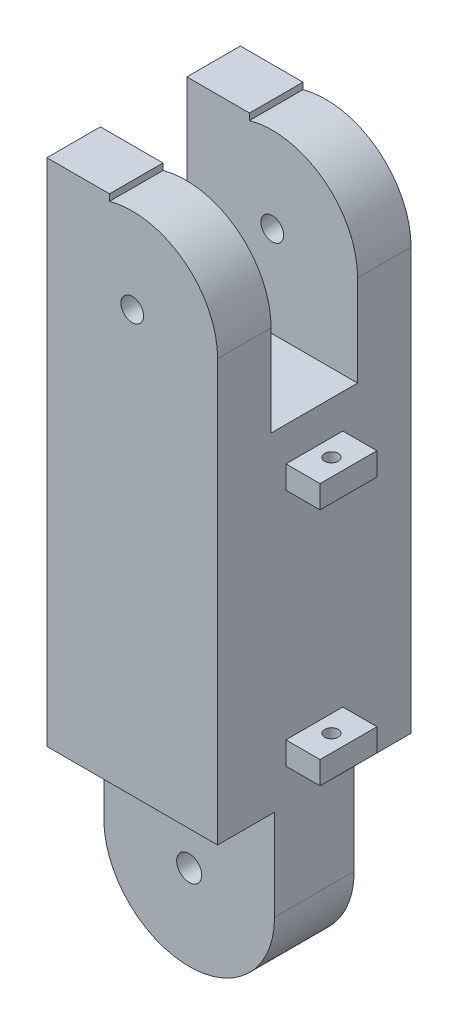
ISO-10303-21;
HEADER;
FILE_DESCRIPTION(('STEP AP214'),'2;1');
FILE_NAME('part.step','',(''),(''),'','','');
FILE_SCHEMA(('AUTOMOTIVE_DESIGN { 1 0 10303 214 1 1 1 1 }'));
ENDSEC;
DATA;
#1=APPLICATION_CONTEXT('core data for automotive mechanical design processes');
#2=APPLICATION_PROTOCOL_DEFINITION('international standard','automotive_design',2000,#1);
#3=PRODUCT_CONTEXT('',#1,'mechanical');
#4=PRODUCT('Part','Part','',(#3));
#5=PRODUCT_RELATED_PRODUCT_CATEGORY('part','',(#4));
#6=PRODUCT_DEFINITION_FORMATION('','',#4);
#7=PRODUCT_DEFINITION_CONTEXT('part definition',#1,'design');
#8=PRODUCT_DEFINITION('design','',#6,#7);
#9=PRODUCT_DEFINITION_SHAPE('','',#8);
#10=(LENGTH_UNIT() NAMED_UNIT(*) SI_UNIT(.MILLI.,.METRE.));
#11=(NAMED_UNIT(*) PLANE_ANGLE_UNIT() SI_UNIT($,.RADIAN.));
#12=(NAMED_UNIT(*) SI_UNIT($,.STERADIAN.) SOLID_ANGLE_UNIT());
#13=UNCERTAINTY_MEASURE_WITH_UNIT(LENGTH_MEASURE(1.E-05),#10,'distance_accuracy_value','');
#14=(GEOMETRIC_REPRESENTATION_CONTEXT(3) GLOBAL_UNCERTAINTY_ASSIGNED_CONTEXT((#13)) GLOBAL_UNIT_ASSIGNED_CONTEXT((#10,
#11,#12)) REPRESENTATION_CONTEXT('',''));
#15=CARTESIAN_POINT('',(0.,0.,0.));
#16=DIRECTION('',(0.,0.,1.));
#17=DIRECTION('',(1.,0.,0.));
#18=AXIS2_PLACEMENT_3D('',#15,#16,#17);
#19=CARTESIAN_POINT('',(7.5,0.,8.5));
#20=DIRECTION('',(-1.,0.,0.));
#21=DIRECTION('',(0.,0.,1.));
#22=AXIS2_PLACEMENT_3D('',#19,#20,#21);
#23=PLANE('',#22);
#24=DIRECTION('',(0.,1.,0.));
#25=VECTOR('',#24,1.);
#26=CARTESIAN_POINT('',(7.5,37.,-3.8));
#27=LINE('',#26,#25);
#28=CARTESIAN_POINT('',(7.5,37.,-3.8));
#29=VERTEX_POINT('',#28);
#30=CARTESIAN_POINT('',(7.5,45.,-3.8));
#31=VERTEX_POINT('',#30);
#32=EDGE_CURVE('E266',#29,#31,#27,.T.);
#33=ORIENTED_EDGE('',*,*,#32,.F.);
#34=DIRECTION('',(0.,0.,-1.));
#35=VECTOR('',#34,1.);
#36=CARTESIAN_POINT('',(7.5,37.,-3.8));
#37=LINE('',#36,#35);
#38=CARTESIAN_POINT('',(7.5,37.,3.8));
#39=VERTEX_POINT('',#38);
#40=EDGE_CURVE('E269',#39,#29,#37,.T.);
#41=ORIENTED_EDGE('',*,*,#40,.F.);
#42=DIRECTION('',(0.,-1.,0.));
#43=VECTOR('',#42,1.);
#44=CARTESIAN_POINT('',(7.5,37.,3.8));
#45=LINE('',#44,#43);
#46=CARTESIAN_POINT('',(7.5,45.,3.8));
#47=VERTEX_POINT('',#46);
#48=EDGE_CURVE('E268',#47,#39,#45,.T.);
#49=ORIENTED_EDGE('',*,*,#48,.F.);
#50=DIRECTION('',(0.,0.,-1.));
#51=VECTOR('',#50,1.);
#52=CARTESIAN_POINT('',(7.5,45.,8.5));
#53=LINE('',#52,#51);
#54=CARTESIAN_POINT('',(7.5,45.,8.5));
#55=VERTEX_POINT('',#54);
#56=EDGE_CURVE('E369',#55,#47,#53,.T.);
#57=ORIENTED_EDGE('',*,*,#56,.F.);
#58=DIRECTION('',(0.,1.,0.));
#59=VECTOR('',#58,1.);
#60=CARTESIAN_POINT('',(7.5,0.,8.5));
#61=LINE('',#60,#59);
#62=CARTESIAN_POINT('',(7.5,7.99813007926781,8.5));
#63=VERTEX_POINT('',#62);
#64=EDGE_CURVE('E349',#63,#55,#61,.T.);
#65=ORIENTED_EDGE('',*,*,#64,.F.);
#66=DIRECTION('',(0.,0.,1.));
#67=VECTOR('',#66,1.);
#68=CARTESIAN_POINT('',(7.5,7.99813007926781,3.5));
#69=LINE('',#68,#67);
#70=CARTESIAN_POINT('',(7.5,7.99813007926781,3.5));
#71=VERTEX_POINT('',#70);
#72=EDGE_CURVE('E339',#71,#63,#69,.T.);
#73=ORIENTED_EDGE('',*,*,#72,.F.);
#74=DIRECTION('',(0.,1.,0.));
#75=VECTOR('',#74,1.);
#76=CARTESIAN_POINT('',(7.5,-8.,3.5));
#77=LINE('',#76,#75);
#78=CARTESIAN_POINT('',(7.5,0.,3.5));
#79=VERTEX_POINT('',#78);
#80=EDGE_CURVE('E385',#79,#71,#77,.T.);
#81=ORIENTED_EDGE('',*,*,#80,.F.);
#82=DIRECTION('',(0.,0.,-1.));
#83=VECTOR('',#82,1.);
#84=CARTESIAN_POINT('',(7.5,0.,8.5));
#85=LINE('',#84,#83);
#86=CARTESIAN_POINT('',(7.5,0.,-3.5));
#87=VERTEX_POINT('',#86);
#88=EDGE_CURVE('E375',#79,#87,#85,.T.);
#89=ORIENTED_EDGE('',*,*,#88,.T.);
#90=DIRECTION('',(0.,-1.,0.));
#91=VECTOR('',#90,1.);
#92=CARTESIAN_POINT('',(7.5,-8.,-3.5));
#93=LINE('',#92,#91);
#94=CARTESIAN_POINT('',(7.5,7.99813007926781,-3.5));
#95=VERTEX_POINT('',#94);
#96=EDGE_CURVE('E383',#95,#87,#93,.T.);
#97=ORIENTED_EDGE('',*,*,#96,.F.);
#98=DIRECTION('',(0.,0.,1.));
#99=VECTOR('',#98,1.);
#100=CARTESIAN_POINT('',(7.5,7.99813007926781,-3.5));
#101=LINE('',#100,#99);
#102=CARTESIAN_POINT('',(7.5,7.99813007926781,-8.5));
#103=VERTEX_POINT('',#102);
#104=EDGE_CURVE('E330',#103,#95,#101,.T.);
#105=ORIENTED_EDGE('',*,*,#104,.F.);
#106=DIRECTION('',(0.,1.,0.));
#107=VECTOR('',#106,1.);
#108=CARTESIAN_POINT('',(7.5,0.,-8.5));
#109=LINE('',#108,#107);
#110=CARTESIAN_POINT('',(7.5,45.,-8.5));
#111=VERTEX_POINT('',#110);
#112=EDGE_CURVE('E346',#103,#111,#109,.T.);
#113=ORIENTED_EDGE('',*,*,#112,.T.);
#114=EDGE_CURVE('E366',#31,#111,#53,.T.);
#115=ORIENTED_EDGE('',*,*,#114,.F.);
#116=EDGE_LOOP('',(#33,#41,#49,#57,#65,#73,#81,#89,#97,#105,#113,#115));
#117=FACE_BOUND('',#116,.T.);
#118=DIRECTION('',(0.,0.,-1.));
#119=VECTOR('',#118,1.);
#120=CARTESIAN_POINT('',(7.5,11.,8.5));
#121=LINE('',#120,#119);
#122=CARTESIAN_POINT('',(7.5,11.,2.5));
#123=VERTEX_POINT('',#122);
#124=CARTESIAN_POINT('',(7.5,11.,-2.5));
#125=VERTEX_POINT('',#124);
#126=EDGE_CURVE('E65',#123,#125,#121,.T.);
#127=ORIENTED_EDGE('',*,*,#126,.F.);
#128=DIRECTION('',(0.,1.,0.));
#129=VECTOR('',#128,1.);
#130=CARTESIAN_POINT('',(7.5,0.,2.5));
#131=LINE('',#130,#129);
#132=CARTESIAN_POINT('',(7.5,13.,2.5));
#133=VERTEX_POINT('',#132);
#134=EDGE_CURVE('E401',#123,#133,#131,.T.);
#135=ORIENTED_EDGE('',*,*,#134,.T.);
#136=DIRECTION('',(0.,0.,1.));
#137=VECTOR('',#136,1.);
#138=CARTESIAN_POINT('',(7.5,13.,8.5));
#139=LINE('',#138,#137);
#140=CARTESIAN_POINT('',(7.5,13.,-2.5));
#141=VERTEX_POINT('',#140);
#142=EDGE_CURVE('E399',#141,#133,#139,.T.);
#143=ORIENTED_EDGE('',*,*,#142,.F.);
#144=DIRECTION('',(0.,1.,0.));
#145=VECTOR('',#144,1.);
#146=CARTESIAN_POINT('',(7.5,0.,-2.5));
#147=LINE('',#146,#145);
#148=EDGE_CURVE('E394',#125,#141,#147,.T.);
#149=ORIENTED_EDGE('',*,*,#148,.F.);
#150=EDGE_LOOP('',(#127,#135,#143,#149));
#151=FACE_BOUND('',#150,.T.);
#152=DIRECTION('',(0.,-1.,0.));
#153=VECTOR('',#152,1.);
#154=CARTESIAN_POINT('',(7.5,0.,2.5));
#155=LINE('',#154,#153);
#156=CARTESIAN_POINT('',(7.5,34.,2.5));
#157=VERTEX_POINT('',#156);
#158=CARTESIAN_POINT('',(7.5,32.,2.5));
#159=VERTEX_POINT('',#158);
#160=EDGE_CURVE('E11',#157,#159,#155,.T.);
#161=ORIENTED_EDGE('',*,*,#160,.F.);
#162=DIRECTION('',(0.,0.,1.));
#163=VECTOR('',#162,1.);
#164=CARTESIAN_POINT('',(7.5,34.,8.5));
#165=LINE('',#164,#163);
#166=CARTESIAN_POINT('',(7.5,34.,-2.5));
#167=VERTEX_POINT('',#166);
#168=EDGE_CURVE('E410',#167,#157,#165,.T.);
#169=ORIENTED_EDGE('',*,*,#168,.F.);
#170=DIRECTION('',(0.,-1.,0.));
#171=VECTOR('',#170,1.);
#172=CARTESIAN_POINT('',(7.5,0.,-2.5));
#173=LINE('',#172,#171);
#174=CARTESIAN_POINT('',(7.5,32.,-2.5));
#175=VERTEX_POINT('',#174);
#176=EDGE_CURVE('E403',#167,#175,#173,.T.);
#177=ORIENTED_EDGE('',*,*,#176,.T.);
#178=DIRECTION('',(0.,0.,-1.));
#179=VECTOR('',#178,1.);
#180=CARTESIAN_POINT('',(7.5,32.,8.5));
#181=LINE('',#180,#179);
#182=EDGE_CURVE('E48',#159,#175,#181,.T.);
#183=ORIENTED_EDGE('',*,*,#182,.F.);
#184=EDGE_LOOP('',(#161,#169,#177,#183));
#185=FACE_BOUND('',#184,.T.);
#186=ADVANCED_FACE('F39',(#117,#151,#185),#23,.F.);
#187=CARTESIAN_POINT('',(0.,45.,8.5));
#188=DIRECTION('',(0.,0.,-1.));
#189=DIRECTION('',(-1.,0.,0.));
#190=AXIS2_PLACEMENT_3D('',#187,#188,#189);
#191=CYLINDRICAL_SURFACE('',#190,7.5);
#192=DIRECTION('',(0.,0.,-1.));
#193=VECTOR('',#192,1.);
#194=CARTESIAN_POINT('',(-2.,52.2284161474005,8.5));
#195=LINE('',#194,#193);
#196=CARTESIAN_POINT('',(-2.,52.2284161474005,-3.8));
#197=VERTEX_POINT('',#196);
#198=CARTESIAN_POINT('',(-2.,52.2284161474005,-8.5));
#199=VERTEX_POINT('',#198);
#200=EDGE_CURVE('E318',#197,#199,#195,.T.);
#201=ORIENTED_EDGE('',*,*,#200,.F.);
#202=CARTESIAN_POINT('',(0.,45.,-3.8));
#203=DIRECTION('',(0.,0.,-1.));
#204=DIRECTION('',(-1.,0.,0.));
#205=AXIS2_PLACEMENT_3D('',#202,#203,#204);
#206=CIRCLE('',#205,7.5);
#207=EDGE_CURVE('E297',#197,#31,#206,.T.);
#208=ORIENTED_EDGE('',*,*,#207,.T.);
#209=ORIENTED_EDGE('',*,*,#114,.T.);
#210=CARTESIAN_POINT('',(0.,45.,-8.5));
#211=DIRECTION('',(0.,0.,1.));
#212=DIRECTION('',(1.,0.,0.));
#213=AXIS2_PLACEMENT_3D('',#210,#211,#212);
#214=CIRCLE('',#213,7.5);
#215=EDGE_CURVE('E363',#111,#199,#214,.T.);
#216=ORIENTED_EDGE('',*,*,#215,.T.);
#217=EDGE_LOOP('',(#201,#208,#209,#216));
#218=FACE_BOUND('',#217,.T.);
#219=ADVANCED_FACE('F435',(#218),#191,.T.);
#220=CARTESIAN_POINT('',(-2.,45.,8.5));
#221=DIRECTION('',(-1.,0.,0.));
#222=DIRECTION('',(0.,0.,1.));
#223=AXIS2_PLACEMENT_3D('',#220,#221,#222);
#224=PLANE('',#223);
#225=DIRECTION('',(0.,0.,-1.));
#226=VECTOR('',#225,1.);
#227=CARTESIAN_POINT('',(-2.,52.8,8.5));
#228=LINE('',#227,#226);
#229=CARTESIAN_POINT('',(-2.,52.8,-3.8));
#230=VERTEX_POINT('',#229);
#231=CARTESIAN_POINT('',(-2.,52.8,-8.5));
#232=VERTEX_POINT('',#231);
#233=EDGE_CURVE('E314',#230,#232,#228,.T.);
#234=ORIENTED_EDGE('',*,*,#233,.F.);
#235=DIRECTION('',(0.,-1.,0.));
#236=VECTOR('',#235,1.);
#237=CARTESIAN_POINT('',(-2.,45.,-3.8));
#238=LINE('',#237,#236);
#239=EDGE_CURVE('E291',#230,#197,#238,.T.);
#240=ORIENTED_EDGE('',*,*,#239,.T.);
#241=ORIENTED_EDGE('',*,*,#200,.T.);
#242=DIRECTION('',(0.,1.,0.));
#243=VECTOR('',#242,1.);
#244=CARTESIAN_POINT('',(-2.,45.,-8.5));
#245=LINE('',#244,#243);
#246=EDGE_CURVE('E296',#199,#232,#245,.T.);
#247=ORIENTED_EDGE('',*,*,#246,.T.);
#248=EDGE_LOOP('',(#234,#240,#241,#247));
#249=FACE_BOUND('',#248,.T.);
#250=ADVANCED_FACE('F437',(#249),#224,.F.);
#251=CARTESIAN_POINT('',(-7.5,52.8,8.5));
#252=DIRECTION('',(0.,-1.,0.));
#253=DIRECTION('',(0.,0.,-1.));
#254=AXIS2_PLACEMENT_3D('',#251,#252,#253);
#255=PLANE('',#254);
#256=DIRECTION('',(0.,0.,-1.));
#257=VECTOR('',#256,1.);
#258=CARTESIAN_POINT('',(-7.5,52.8,8.5));
#259=LINE('',#258,#257);
#260=CARTESIAN_POINT('',(-7.5,52.8,-3.8));
#261=VERTEX_POINT('',#260);
#262=CARTESIAN_POINT('',(-7.5,52.8,-8.5));
#263=VERTEX_POINT('',#262);
#264=EDGE_CURVE('E308',#261,#263,#259,.T.);
#265=ORIENTED_EDGE('',*,*,#264,.F.);
#266=DIRECTION('',(1.,0.,0.));
#267=VECTOR('',#266,1.);
#268=CARTESIAN_POINT('',(-7.5,52.8,-3.8));
#269=LINE('',#268,#267);
#270=EDGE_CURVE('E386',#261,#230,#269,.T.);
#271=ORIENTED_EDGE('',*,*,#270,.T.);
#272=ORIENTED_EDGE('',*,*,#233,.T.);
#273=DIRECTION('',(-1.,0.,0.));
#274=VECTOR('',#273,1.);
#275=CARTESIAN_POINT('',(-7.5,52.8,-8.5));
#276=LINE('',#275,#274);
#277=EDGE_CURVE('E303',#232,#263,#276,.T.);
#278=ORIENTED_EDGE('',*,*,#277,.T.);
#279=EDGE_LOOP('',(#265,#271,#272,#278));
#280=FACE_BOUND('',#279,.T.);
#281=ADVANCED_FACE('F443',(#280),#255,.F.);
#282=ORIENTED_EDGE('',*,*,#56,.T.);
#283=CARTESIAN_POINT('',(0.,45.,3.8));
#284=DIRECTION('',(0.,0.,1.));
#285=DIRECTION('',(0.,-1.,0.));
#286=AXIS2_PLACEMENT_3D('',#283,#284,#285);
#287=CIRCLE('',#286,7.5);
#288=CARTESIAN_POINT('',(-2.,52.2284161474005,3.8));
#289=VERTEX_POINT('',#288);
#290=EDGE_CURVE('E286',#47,#289,#287,.T.);
#291=ORIENTED_EDGE('',*,*,#290,.T.);
#292=CARTESIAN_POINT('',(-2.,52.2284161474005,8.5));
#293=VERTEX_POINT('',#292);
#294=EDGE_CURVE('E317',#293,#289,#195,.T.);
#295=ORIENTED_EDGE('',*,*,#294,.F.);
#296=CARTESIAN_POINT('',(0.,45.,8.5));
#297=DIRECTION('',(0.,0.,1.));
#298=DIRECTION('',(1.,0.,0.));
#299=AXIS2_PLACEMENT_3D('',#296,#297,#298);
#300=CIRCLE('',#299,7.5);
#301=EDGE_CURVE('E352',#55,#293,#300,.T.);
#302=ORIENTED_EDGE('',*,*,#301,.F.);
#303=EDGE_LOOP('',(#282,#291,#295,#302));
#304=FACE_BOUND('',#303,.T.);
#305=ADVANCED_FACE('F442',(#304),#191,.T.);
#306=CARTESIAN_POINT('',(0.,0.,8.5));
#307=DIRECTION('',(0.,0.,-1.));
#308=DIRECTION('',(-1.,0.,0.));
#309=AXIS2_PLACEMENT_3D('',#306,#307,#308);
#310=CYLINDRICAL_SURFACE('',#309,7.5);
#311=DIRECTION('',(0.,0.,-1.));
#312=VECTOR('',#311,1.);
#313=CARTESIAN_POINT('',(-7.5,0.,8.5));
#314=LINE('',#313,#312);
#315=CARTESIAN_POINT('',(-7.5,0.,3.5));
#316=VERTEX_POINT('',#315);
#317=CARTESIAN_POINT('',(-7.5,0.,-3.5));
#318=VERTEX_POINT('',#317);
#319=EDGE_CURVE('E358',#316,#318,#314,.T.);
#320=ORIENTED_EDGE('',*,*,#319,.T.);
#321=CARTESIAN_POINT('',(0.,0.,-3.5));
#322=DIRECTION('',(0.,0.,1.));
#323=DIRECTION('',(1.,0.,0.));
#324=AXIS2_PLACEMENT_3D('',#321,#322,#323);
#325=CIRCLE('',#324,7.5);
#326=EDGE_CURVE('E341',#318,#87,#325,.T.);
#327=ORIENTED_EDGE('',*,*,#326,.T.);
#328=ORIENTED_EDGE('',*,*,#88,.F.);
#329=CARTESIAN_POINT('',(0.,0.,3.5));
#330=DIRECTION('',(0.,0.,-1.));
#331=DIRECTION('',(-1.,0.,0.));
#332=AXIS2_PLACEMENT_3D('',#329,#330,#331);
#333=CIRCLE('',#332,7.5);
#334=EDGE_CURVE('E338',#79,#316,#333,.T.);
#335=ORIENTED_EDGE('',*,*,#334,.T.);
#336=EDGE_LOOP('',(#320,#327,#328,#335));
#337=FACE_BOUND('',#336,.T.);
#338=ADVANCED_FACE('F41',(#337),#310,.T.);
#339=CARTESIAN_POINT('',(-7.5,0.,8.5));
#340=DIRECTION('',(1.,0.,0.));
#341=DIRECTION('',(0.,0.,-1.));
#342=AXIS2_PLACEMENT_3D('',#339,#340,#341);
#343=PLANE('',#342);
#344=DIRECTION('',(0.,0.,-1.));
#345=VECTOR('',#344,1.);
#346=CARTESIAN_POINT('',(-7.5,37.,-3.8));
#347=LINE('',#346,#345);
#348=CARTESIAN_POINT('',(-7.5,37.,3.8));
#349=VERTEX_POINT('',#348);
#350=CARTESIAN_POINT('',(-7.5,37.,-3.8));
#351=VERTEX_POINT('',#350);
#352=EDGE_CURVE('E276',#349,#351,#347,.T.);
#353=ORIENTED_EDGE('',*,*,#352,.T.);
#354=DIRECTION('',(0.,1.,0.));
#355=VECTOR('',#354,1.);
#356=CARTESIAN_POINT('',(-7.5,37.,-3.8));
#357=LINE('',#356,#355);
#358=EDGE_CURVE('E272',#351,#261,#357,.T.);
#359=ORIENTED_EDGE('',*,*,#358,.T.);
#360=ORIENTED_EDGE('',*,*,#264,.T.);
#361=DIRECTION('',(0.,-1.,0.));
#362=VECTOR('',#361,1.);
#363=CARTESIAN_POINT('',(-7.5,0.,-8.5));
#364=LINE('',#363,#362);
#365=CARTESIAN_POINT('',(-7.5,7.99813007926781,-8.5));
#366=VERTEX_POINT('',#365);
#367=EDGE_CURVE('E354',#263,#366,#364,.T.);
#368=ORIENTED_EDGE('',*,*,#367,.T.);
#369=DIRECTION('',(0.,0.,1.));
#370=VECTOR('',#369,1.);
#371=CARTESIAN_POINT('',(-7.5,7.99813007926781,-3.5));
#372=LINE('',#371,#370);
#373=CARTESIAN_POINT('',(-7.5,7.99813007926781,-3.5));
#374=VERTEX_POINT('',#373);
#375=EDGE_CURVE('E326',#366,#374,#372,.T.);
#376=ORIENTED_EDGE('',*,*,#375,.T.);
#377=DIRECTION('',(0.,-1.,0.));
#378=VECTOR('',#377,1.);
#379=CARTESIAN_POINT('',(-7.5,-8.,-3.5));
#380=LINE('',#379,#378);
#381=EDGE_CURVE('E323',#374,#318,#380,.T.);
#382=ORIENTED_EDGE('',*,*,#381,.T.);
#383=ORIENTED_EDGE('',*,*,#319,.F.);
#384=DIRECTION('',(0.,1.,0.));
#385=VECTOR('',#384,1.);
#386=CARTESIAN_POINT('',(-7.5,-8.,3.5));
#387=LINE('',#386,#385);
#388=CARTESIAN_POINT('',(-7.5,7.99813007926781,3.5));
#389=VERTEX_POINT('',#388);
#390=EDGE_CURVE('E331',#316,#389,#387,.T.);
#391=ORIENTED_EDGE('',*,*,#390,.T.);
#392=DIRECTION('',(0.,0.,1.));
#393=VECTOR('',#392,1.);
#394=CARTESIAN_POINT('',(-7.5,7.99813007926781,3.5));
#395=LINE('',#394,#393);
#396=CARTESIAN_POINT('',(-7.5,7.99813007926781,8.5));
#397=VERTEX_POINT('',#396);
#398=EDGE_CURVE('E332',#389,#397,#395,.T.);
#399=ORIENTED_EDGE('',*,*,#398,.T.);
#400=DIRECTION('',(0.,-1.,0.));
#401=VECTOR('',#400,1.);
#402=CARTESIAN_POINT('',(-7.5,0.,8.5));
#403=LINE('',#402,#401);
#404=CARTESIAN_POINT('',(-7.5,52.8,8.5));
#405=VERTEX_POINT('',#404);
#406=EDGE_CURVE('E353',#405,#397,#403,.T.);
#407=ORIENTED_EDGE('',*,*,#406,.F.);
#408=CARTESIAN_POINT('',(-7.5,52.8,3.8));
#409=VERTEX_POINT('',#408);
#410=EDGE_CURVE('E313',#405,#409,#259,.T.);
#411=ORIENTED_EDGE('',*,*,#410,.T.);
#412=DIRECTION('',(0.,-1.,0.));
#413=VECTOR('',#412,1.);
#414=CARTESIAN_POINT('',(-7.5,37.,3.8));
#415=LINE('',#414,#413);
#416=EDGE_CURVE('E277',#409,#349,#415,.T.);
#417=ORIENTED_EDGE('',*,*,#416,.T.);
#418=EDGE_LOOP('',(#353,#359,#360,#368,#376,#382,#383,#391,#399,#407,#411,#417));
#419=FACE_BOUND('',#418,.T.);
#420=ADVANCED_FACE('F449',(#419),#343,.F.);
#421=CARTESIAN_POINT('',(0.,0.,8.5));
#422=DIRECTION('',(0.,0.,1.));
#423=DIRECTION('',(1.,0.,0.));
#424=AXIS2_PLACEMENT_3D('',#421,#422,#423);
#425=PLANE('',#424);
#426=CARTESIAN_POINT('',(0.,45.,8.5));
#427=DIRECTION('',(0.,0.,1.));
#428=DIRECTION('',(1.,0.,0.));
#429=AXIS2_PLACEMENT_3D('',#426,#427,#428);
#430=CIRCLE('',#429,1.);
#431=CARTESIAN_POINT('',(1.,45.,8.5));
#432=VERTEX_POINT('',#431);
#433=EDGE_CURVE('E254',#432,#432,#430,.T.);
#434=ORIENTED_EDGE('',*,*,#433,.F.);
#435=EDGE_LOOP('',(#434));
#436=FACE_BOUND('',#435,.T.);
#437=ORIENTED_EDGE('',*,*,#301,.T.);
#438=DIRECTION('',(0.,1.,0.));
#439=VECTOR('',#438,1.);
#440=CARTESIAN_POINT('',(-2.,45.,8.5));
#441=LINE('',#440,#439);
#442=CARTESIAN_POINT('',(-2.,52.8,8.5));
#443=VERTEX_POINT('',#442);
#444=EDGE_CURVE('E298',#293,#443,#441,.T.);
#445=ORIENTED_EDGE('',*,*,#444,.T.);
#446=DIRECTION('',(-1.,0.,0.));
#447=VECTOR('',#446,1.);
#448=CARTESIAN_POINT('',(-7.5,52.8,8.5));
#449=LINE('',#448,#447);
#450=EDGE_CURVE('E305',#443,#405,#449,.T.);
#451=ORIENTED_EDGE('',*,*,#450,.T.);
#452=ORIENTED_EDGE('',*,*,#406,.T.);
#453=DIRECTION('',(-1.,0.,0.));
#454=VECTOR('',#453,1.);
#455=CARTESIAN_POINT('',(0.,7.99813007926781,8.5));
#456=LINE('',#455,#454);
#457=EDGE_CURVE('E376',#63,#397,#456,.T.);
#458=ORIENTED_EDGE('',*,*,#457,.F.);
#459=ORIENTED_EDGE('',*,*,#64,.T.);
#460=EDGE_LOOP('',(#437,#445,#451,#452,#458,#459));
#461=FACE_BOUND('',#460,.T.);
#462=ADVANCED_FACE('F448',(#436,#461),#425,.T.);
#463=CARTESIAN_POINT('',(0.,0.,-8.5));
#464=DIRECTION('',(0.,0.,1.));
#465=DIRECTION('',(1.,0.,0.));
#466=AXIS2_PLACEMENT_3D('',#463,#464,#465);
#467=PLANE('',#466);
#468=CARTESIAN_POINT('',(0.,45.,-8.5));
#469=DIRECTION('',(0.,0.,1.));
#470=DIRECTION('',(1.,0.,0.));
#471=AXIS2_PLACEMENT_3D('',#468,#469,#470);
#472=CIRCLE('',#471,1.);
#473=CARTESIAN_POINT('',(1.,45.,-8.5));
#474=VERTEX_POINT('',#473);
#475=EDGE_CURVE('E252',#474,#474,#472,.T.);
#476=ORIENTED_EDGE('',*,*,#475,.T.);
#477=EDGE_LOOP('',(#476));
#478=FACE_BOUND('',#477,.T.);
#479=ORIENTED_EDGE('',*,*,#367,.F.);
#480=ORIENTED_EDGE('',*,*,#277,.F.);
#481=ORIENTED_EDGE('',*,*,#246,.F.);
#482=ORIENTED_EDGE('',*,*,#215,.F.);
#483=ORIENTED_EDGE('',*,*,#112,.F.);
#484=DIRECTION('',(-1.,0.,0.));
#485=VECTOR('',#484,1.);
#486=CARTESIAN_POINT('',(0.,7.99813007926781,-8.5));
#487=LINE('',#486,#485);
#488=EDGE_CURVE('E373',#103,#366,#487,.T.);
#489=ORIENTED_EDGE('',*,*,#488,.T.);
#490=EDGE_LOOP('',(#479,#480,#481,#482,#483,#489));
#491=FACE_BOUND('',#490,.T.);
#492=ADVANCED_FACE('F455',(#478,#491),#467,.F.);
#493=CARTESIAN_POINT('',(-7.5,-8.,-3.5));
#494=DIRECTION('',(0.,0.,1.));
#495=DIRECTION('',(1.,0.,0.));
#496=AXIS2_PLACEMENT_3D('',#493,#494,#495);
#497=PLANE('',#496);
#498=CARTESIAN_POINT('',(0.,0.,-3.5));
#499=DIRECTION('',(0.,0.,1.));
#500=DIRECTION('',(1.,0.,0.));
#501=AXIS2_PLACEMENT_3D('',#498,#499,#500);
#502=CIRCLE('',#501,1.1);
#503=CARTESIAN_POINT('',(1.1,0.,-3.5));
#504=VERTEX_POINT('',#503);
#505=EDGE_CURVE('E263',#504,#504,#502,.T.);
#506=ORIENTED_EDGE('',*,*,#505,.T.);
#507=EDGE_LOOP('',(#506));
#508=FACE_BOUND('',#507,.T.);
#509=ORIENTED_EDGE('',*,*,#381,.F.);
#510=DIRECTION('',(1.,0.,0.));
#511=VECTOR('',#510,1.);
#512=CARTESIAN_POINT('',(-7.5,7.99813007926781,-3.5));
#513=LINE('',#512,#511);
#514=EDGE_CURVE('E329',#374,#95,#513,.T.);
#515=ORIENTED_EDGE('',*,*,#514,.T.);
#516=ORIENTED_EDGE('',*,*,#96,.T.);
#517=ORIENTED_EDGE('',*,*,#326,.F.);
#518=EDGE_LOOP('',(#509,#515,#516,#517));
#519=FACE_BOUND('',#518,.T.);
#520=ADVANCED_FACE('F451',(#508,#519),#497,.F.);
#521=CARTESIAN_POINT('',(-7.5,7.99813007926781,-3.5));
#522=DIRECTION('',(0.,1.,0.));
#523=DIRECTION('',(0.,0.,1.));
#524=AXIS2_PLACEMENT_3D('',#521,#522,#523);
#525=PLANE('',#524);
#526=ORIENTED_EDGE('',*,*,#104,.T.);
#527=ORIENTED_EDGE('',*,*,#514,.F.);
#528=ORIENTED_EDGE('',*,*,#375,.F.);
#529=ORIENTED_EDGE('',*,*,#488,.F.);
#530=EDGE_LOOP('',(#526,#527,#528,#529));
#531=FACE_BOUND('',#530,.T.);
#532=ADVANCED_FACE('F468',(#531),#525,.F.);
#533=CARTESIAN_POINT('',(-7.5,-8.,3.5));
#534=DIRECTION('',(0.,0.,-1.));
#535=DIRECTION('',(-1.,0.,0.));
#536=AXIS2_PLACEMENT_3D('',#533,#534,#535);
#537=PLANE('',#536);
#538=CARTESIAN_POINT('',(0.,0.,3.5));
#539=DIRECTION('',(0.,0.,-1.));
#540=DIRECTION('',(-1.,0.,0.));
#541=AXIS2_PLACEMENT_3D('',#538,#539,#540);
#542=CIRCLE('',#541,1.1);
#543=CARTESIAN_POINT('',(1.1,0.,3.5));
#544=VERTEX_POINT('',#543);
#545=EDGE_CURVE('E265',#544,#544,#542,.T.);
#546=ORIENTED_EDGE('',*,*,#545,.T.);
#547=EDGE_LOOP('',(#546));
#548=FACE_BOUND('',#547,.T.);
#549=ORIENTED_EDGE('',*,*,#80,.T.);
#550=DIRECTION('',(1.,0.,0.));
#551=VECTOR('',#550,1.);
#552=CARTESIAN_POINT('',(-7.5,7.99813007926781,3.5));
#553=LINE('',#552,#551);
#554=EDGE_CURVE('E325',#389,#71,#553,.T.);
#555=ORIENTED_EDGE('',*,*,#554,.F.);
#556=ORIENTED_EDGE('',*,*,#390,.F.);
#557=ORIENTED_EDGE('',*,*,#334,.F.);
#558=EDGE_LOOP('',(#549,#555,#556,#557));
#559=FACE_BOUND('',#558,.T.);
#560=ADVANCED_FACE('F461',(#548,#559),#537,.F.);
#561=CARTESIAN_POINT('',(-7.5,7.99813007926781,3.5));
#562=DIRECTION('',(0.,1.,0.));
#563=DIRECTION('',(0.,0.,1.));
#564=AXIS2_PLACEMENT_3D('',#561,#562,#563);
#565=PLANE('',#564);
#566=ORIENTED_EDGE('',*,*,#457,.T.);
#567=ORIENTED_EDGE('',*,*,#398,.F.);
#568=ORIENTED_EDGE('',*,*,#554,.T.);
#569=ORIENTED_EDGE('',*,*,#72,.T.);
#570=EDGE_LOOP('',(#566,#567,#568,#569));
#571=FACE_BOUND('',#570,.T.);
#572=ADVANCED_FACE('F458',(#571),#565,.F.);
#573=ORIENTED_EDGE('',*,*,#294,.T.);
#574=DIRECTION('',(0.,1.,0.));
#575=VECTOR('',#574,1.);
#576=CARTESIAN_POINT('',(-2.,45.,3.8));
#577=LINE('',#576,#575);
#578=CARTESIAN_POINT('',(-2.,52.8,3.8));
#579=VERTEX_POINT('',#578);
#580=EDGE_CURVE('E283',#289,#579,#577,.T.);
#581=ORIENTED_EDGE('',*,*,#580,.T.);
#582=EDGE_CURVE('E312',#443,#579,#228,.T.);
#583=ORIENTED_EDGE('',*,*,#582,.F.);
#584=ORIENTED_EDGE('',*,*,#444,.F.);
#585=EDGE_LOOP('',(#573,#581,#583,#584));
#586=FACE_BOUND('',#585,.T.);
#587=ADVANCED_FACE('F465',(#586),#224,.F.);
#588=ORIENTED_EDGE('',*,*,#582,.T.);
#589=DIRECTION('',(-1.,0.,0.));
#590=VECTOR('',#589,1.);
#591=CARTESIAN_POINT('',(-7.5,52.8,3.8));
#592=LINE('',#591,#590);
#593=EDGE_CURVE('E379',#579,#409,#592,.T.);
#594=ORIENTED_EDGE('',*,*,#593,.T.);
#595=ORIENTED_EDGE('',*,*,#410,.F.);
#596=ORIENTED_EDGE('',*,*,#450,.F.);
#597=EDGE_LOOP('',(#588,#594,#595,#596));
#598=FACE_BOUND('',#597,.T.);
#599=ADVANCED_FACE('F476',(#598),#255,.F.);
#600=CARTESIAN_POINT('',(-7.5,37.,-3.8));
#601=DIRECTION('',(0.,0.,-1.));
#602=DIRECTION('',(-1.,0.,0.));
#603=AXIS2_PLACEMENT_3D('',#600,#601,#602);
#604=PLANE('',#603);
#605=CARTESIAN_POINT('',(0.,45.,-3.8));
#606=DIRECTION('',(0.,0.,-1.));
#607=DIRECTION('',(-1.,0.,0.));
#608=AXIS2_PLACEMENT_3D('',#605,#606,#607);
#609=CIRCLE('',#608,1.);
#610=CARTESIAN_POINT('',(-1.,45.,-3.8));
#611=VERTEX_POINT('',#610);
#612=EDGE_CURVE('E259',#611,#611,#609,.T.);
#613=ORIENTED_EDGE('',*,*,#612,.T.);
#614=EDGE_LOOP('',(#613));
#615=FACE_BOUND('',#614,.T.);
#616=ORIENTED_EDGE('',*,*,#239,.F.);
#617=ORIENTED_EDGE('',*,*,#270,.F.);
#618=ORIENTED_EDGE('',*,*,#358,.F.);
#619=DIRECTION('',(1.,0.,0.));
#620=VECTOR('',#619,1.);
#621=CARTESIAN_POINT('',(-7.5,37.,-3.8));
#622=LINE('',#621,#620);
#623=EDGE_CURVE('E285',#351,#29,#622,.T.);
#624=ORIENTED_EDGE('',*,*,#623,.T.);
#625=ORIENTED_EDGE('',*,*,#32,.T.);
#626=ORIENTED_EDGE('',*,*,#207,.F.);
#627=EDGE_LOOP('',(#616,#617,#618,#624,#625,#626));
#628=FACE_BOUND('',#627,.T.);
#629=ADVANCED_FACE('F485',(#615,#628),#604,.F.);
#630=CARTESIAN_POINT('',(-7.5,37.,3.8));
#631=DIRECTION('',(0.,0.,1.));
#632=DIRECTION('',(0.,-1.,0.));
#633=AXIS2_PLACEMENT_3D('',#630,#631,#632);
#634=PLANE('',#633);
#635=CARTESIAN_POINT('',(0.,45.,3.8));
#636=DIRECTION('',(0.,0.,1.));
#637=DIRECTION('',(0.,-1.,0.));
#638=AXIS2_PLACEMENT_3D('',#635,#636,#637);
#639=CIRCLE('',#638,1.);
#640=CARTESIAN_POINT('',(0.,44.,3.8));
#641=VERTEX_POINT('',#640);
#642=EDGE_CURVE('E256',#641,#641,#639,.T.);
#643=ORIENTED_EDGE('',*,*,#642,.T.);
#644=EDGE_LOOP('',(#643));
#645=FACE_BOUND('',#644,.T.);
#646=ORIENTED_EDGE('',*,*,#48,.T.);
#647=DIRECTION('',(1.,0.,0.));
#648=VECTOR('',#647,1.);
#649=CARTESIAN_POINT('',(-7.5,37.,3.8));
#650=LINE('',#649,#648);
#651=EDGE_CURVE('E284',#349,#39,#650,.T.);
#652=ORIENTED_EDGE('',*,*,#651,.F.);
#653=ORIENTED_EDGE('',*,*,#416,.F.);
#654=ORIENTED_EDGE('',*,*,#593,.F.);
#655=ORIENTED_EDGE('',*,*,#580,.F.);
#656=ORIENTED_EDGE('',*,*,#290,.F.);
#657=EDGE_LOOP('',(#646,#652,#653,#654,#655,#656));
#658=FACE_BOUND('',#657,.T.);
#659=ADVANCED_FACE('F486',(#645,#658),#634,.F.);
#660=CARTESIAN_POINT('',(-7.5,37.,-3.8));
#661=DIRECTION('',(0.,-1.,0.));
#662=DIRECTION('',(0.,0.,-1.));
#663=AXIS2_PLACEMENT_3D('',#660,#661,#662);
#664=PLANE('',#663);
#665=ORIENTED_EDGE('',*,*,#623,.F.);
#666=ORIENTED_EDGE('',*,*,#352,.F.);
#667=ORIENTED_EDGE('',*,*,#651,.T.);
#668=ORIENTED_EDGE('',*,*,#40,.T.);
#669=EDGE_LOOP('',(#665,#666,#667,#668));
#670=FACE_BOUND('',#669,.T.);
#671=ADVANCED_FACE('F489',(#670),#664,.F.);
#672=CARTESIAN_POINT('',(0.,45.,-8.5));
#673=DIRECTION('',(0.,0.,1.));
#674=DIRECTION('',(1.,0.,0.));
#675=AXIS2_PLACEMENT_3D('',#672,#673,#674);
#676=CYLINDRICAL_SURFACE('',#675,1.);
#677=ORIENTED_EDGE('',*,*,#433,.T.);
#678=EDGE_LOOP('',(#677));
#679=FACE_BOUND('',#678,.T.);
#680=ORIENTED_EDGE('',*,*,#642,.F.);
#681=EDGE_LOOP('',(#680));
#682=FACE_BOUND('',#681,.T.);
#683=ADVANCED_FACE('F493',(#679,#682),#676,.F.);
#684=ORIENTED_EDGE('',*,*,#475,.F.);
#685=EDGE_LOOP('',(#684));
#686=FACE_BOUND('',#685,.T.);
#687=ORIENTED_EDGE('',*,*,#612,.F.);
#688=EDGE_LOOP('',(#687));
#689=FACE_BOUND('',#688,.T.);
#690=ADVANCED_FACE('F497',(#686,#689),#676,.F.);
#691=CARTESIAN_POINT('',(0.,0.,-8.5));
#692=DIRECTION('',(0.,0.,1.));
#693=DIRECTION('',(1.,0.,0.));
#694=AXIS2_PLACEMENT_3D('',#691,#692,#693);
#695=CYLINDRICAL_SURFACE('',#694,1.1);
#696=CARTESIAN_POINT('',(1.1,0.,3.5));
#697=CARTESIAN_POINT('',(1.1,0.,3.42708333333333));
#698=CARTESIAN_POINT('',(1.1,0.,3.35416666666667));
#699=CARTESIAN_POINT('',(1.1,0.,3.20833333333333));
#700=CARTESIAN_POINT('',(1.1,0.,3.13541666666667));
#701=CARTESIAN_POINT('',(1.1,0.,2.98958333333333));
#702=CARTESIAN_POINT('',(1.1,0.,2.91666666666667));
#703=CARTESIAN_POINT('',(1.1,0.,2.77083333333333));
#704=CARTESIAN_POINT('',(1.1,0.,2.69791666666667));
#705=CARTESIAN_POINT('',(1.1,0.,2.55208333333333));
#706=CARTESIAN_POINT('',(1.1,0.,2.47916666666667));
#707=CARTESIAN_POINT('',(1.1,0.,2.33333333333333));
#708=CARTESIAN_POINT('',(1.1,0.,2.26041666666667));
#709=CARTESIAN_POINT('',(1.1,0.,2.11458333333333));
#710=CARTESIAN_POINT('',(1.1,0.,2.04166666666667));
#711=CARTESIAN_POINT('',(1.1,0.,1.89583333333333));
#712=CARTESIAN_POINT('',(1.1,0.,1.82291666666667));
#713=CARTESIAN_POINT('',(1.1,0.,1.67708333333333));
#714=CARTESIAN_POINT('',(1.1,0.,1.60416666666667));
#715=CARTESIAN_POINT('',(1.1,0.,1.45833333333333));
#716=CARTESIAN_POINT('',(1.1,0.,1.38541666666667));
#717=CARTESIAN_POINT('',(1.1,0.,1.23958333333333));
#718=CARTESIAN_POINT('',(1.1,0.,1.16666666666667));
#719=CARTESIAN_POINT('',(1.1,0.,1.02083333333333));
#720=CARTESIAN_POINT('',(1.1,0.,0.947916666666667));
#721=CARTESIAN_POINT('',(1.1,0.,0.802083333333334));
#722=CARTESIAN_POINT('',(1.1,0.,0.729166666666667));
#723=CARTESIAN_POINT('',(1.1,0.,0.583333333333334));
#724=CARTESIAN_POINT('',(1.1,0.,0.510416666666667));
#725=CARTESIAN_POINT('',(1.1,0.,0.364583333333334));
#726=CARTESIAN_POINT('',(1.1,0.,0.291666666666667));
#727=CARTESIAN_POINT('',(1.1,0.,0.145833333333333));
#728=CARTESIAN_POINT('',(1.1,0.,0.0729166666666667));
#729=CARTESIAN_POINT('',(1.1,0.,-0.0729166666666667));
#730=CARTESIAN_POINT('',(1.1,0.,-0.145833333333333));
#731=CARTESIAN_POINT('',(1.1,0.,-0.291666666666667));
#732=CARTESIAN_POINT('',(1.1,0.,-0.364583333333334));
#733=CARTESIAN_POINT('',(1.1,0.,-0.510416666666667));
#734=CARTESIAN_POINT('',(1.1,0.,-0.583333333333334));
#735=CARTESIAN_POINT('',(1.1,0.,-0.729166666666667));
#736=CARTESIAN_POINT('',(1.1,0.,-0.802083333333333));
#737=CARTESIAN_POINT('',(1.1,0.,-0.947916666666667));
#738=CARTESIAN_POINT('',(1.1,0.,-1.02083333333333));
#739=CARTESIAN_POINT('',(1.1,0.,-1.16666666666667));
#740=CARTESIAN_POINT('',(1.1,0.,-1.23958333333333));
#741=CARTESIAN_POINT('',(1.1,0.,-1.38541666666667));
#742=CARTESIAN_POINT('',(1.1,0.,-1.45833333333333));
#743=CARTESIAN_POINT('',(1.1,0.,-1.60416666666667));
#744=CARTESIAN_POINT('',(1.1,0.,-1.67708333333333));
#745=CARTESIAN_POINT('',(1.1,0.,-1.82291666666667));
#746=CARTESIAN_POINT('',(1.1,0.,-1.89583333333333));
#747=CARTESIAN_POINT('',(1.1,0.,-2.04166666666667));
#748=CARTESIAN_POINT('',(1.1,0.,-2.11458333333333));
#749=CARTESIAN_POINT('',(1.1,0.,-2.26041666666667));
#750=CARTESIAN_POINT('',(1.1,0.,-2.33333333333333));
#751=CARTESIAN_POINT('',(1.1,0.,-2.47916666666667));
#752=CARTESIAN_POINT('',(1.1,0.,-2.55208333333333));
#753=CARTESIAN_POINT('',(1.1,0.,-2.69791666666667));
#754=CARTESIAN_POINT('',(1.1,0.,-2.77083333333333));
#755=CARTESIAN_POINT('',(1.1,0.,-2.91666666666667));
#756=CARTESIAN_POINT('',(1.1,0.,-2.98958333333333));
#757=CARTESIAN_POINT('',(1.1,0.,-3.13541666666667));
#758=CARTESIAN_POINT('',(1.1,0.,-3.20833333333333));
#759=CARTESIAN_POINT('',(1.1,0.,-3.35416666666667));
#760=CARTESIAN_POINT('',(1.1,0.,-3.42708333333333));
#761=CARTESIAN_POINT('',(1.1,0.,-3.5));
#762=B_SPLINE_CURVE_WITH_KNOTS('',3,(#696,#697,#698,#699,#700,#701,#702,#703,#704,#705,#706,
#707,#708,#709,#710,#711,#712,#713,#714,#715,#716,#717,#718,#719,#720,#721,#722,#723,#724,#725,
#726,#727,#728,#729,#730,#731,#732,#733,#734,#735,#736,#737,#738,#739,#740,#741,#742,#743,#744,
#745,#746,#747,#748,#749,#750,#751,#752,#753,#754,#755,#756,#757,#758,#759,#760,#761),
.UNSPECIFIED.,.F.,.F.,(4,2,2,2,2,2,2,2,2,2,2,2,2,2,2,2,2,2,2,2,2,2,2,2,2,2,2,2,2,2,2,2,4),(0.,
0.21875,0.4375,0.656250000000001,0.875000000000001,1.09375,1.3125,1.53125,1.75,1.96875,2.1875,
2.40625,2.625,2.84375,3.0625,3.28125,3.5,3.71875,3.9375,4.15625,4.375,4.59375,4.8125,5.03125,
5.25,5.46875,5.6875,5.90625,6.125,6.34375,6.5625,6.78125,7.),.UNSPECIFIED.);
#763=EDGE_CURVE('BSEAM496',#544,#504,#762,.T.);
#764=ORIENTED_EDGE('',*,*,#545,.F.);
#765=ORIENTED_EDGE('',*,*,#505,.F.);
#766=ORIENTED_EDGE('',*,*,#763,.T.);
#767=ORIENTED_EDGE('',*,*,#763,.F.);
#768=EDGE_LOOP('',(#764,#766,#765,#767));
#769=FACE_BOUND('',#768,.T.);
#770=ADVANCED_FACE('F496',(#769),#695,.F.);
#771=CARTESIAN_POINT('',(7.,11.,2.5));
#772=DIRECTION('',(0.,1.,0.));
#773=DIRECTION('',(-1.,0.,0.));
#774=AXIS2_PLACEMENT_3D('',#771,#772,#773);
#775=PLANE('',#774);
#776=CARTESIAN_POINT('',(9.,11.,0.));
#777=DIRECTION('',(0.,1.,0.));
#778=DIRECTION('',(-1.,0.,0.));
#779=AXIS2_PLACEMENT_3D('',#776,#777,#778);
#780=CIRCLE('',#779,0.6);
#781=CARTESIAN_POINT('',(8.4,11.,0.));
#782=VERTEX_POINT('',#781);
#783=EDGE_CURVE('E230',#782,#782,#780,.F.);
#784=ORIENTED_EDGE('',*,*,#783,.F.);
#785=EDGE_LOOP('',(#784));
#786=FACE_BOUND('',#785,.T.);
#787=DIRECTION('',(1.,0.,0.));
#788=VECTOR('',#787,1.);
#789=CARTESIAN_POINT('',(7.,11.,2.5));
#790=LINE('',#789,#788);
#791=CARTESIAN_POINT('',(10.5,11.,2.5));
#792=VERTEX_POINT('',#791);
#793=EDGE_CURVE('E233',#123,#792,#790,.T.);
#794=ORIENTED_EDGE('',*,*,#793,.F.);
#795=ORIENTED_EDGE('',*,*,#126,.T.);
#796=DIRECTION('',(1.,0.,0.));
#797=VECTOR('',#796,1.);
#798=CARTESIAN_POINT('',(7.,11.,-2.5));
#799=LINE('',#798,#797);
#800=CARTESIAN_POINT('',(10.5,11.,-2.5));
#801=VERTEX_POINT('',#800);
#802=EDGE_CURVE('E214',#125,#801,#799,.T.);
#803=ORIENTED_EDGE('',*,*,#802,.T.);
#804=DIRECTION('',(0.,0.,-1.));
#805=VECTOR('',#804,1.);
#806=CARTESIAN_POINT('',(10.5,11.,2.5));
#807=LINE('',#806,#805);
#808=EDGE_CURVE('E249',#792,#801,#807,.T.);
#809=ORIENTED_EDGE('',*,*,#808,.F.);
#810=EDGE_LOOP('',(#794,#795,#803,#809));
#811=FACE_BOUND('',#810,.T.);
#812=ADVANCED_FACE('F505',(#786,#811),#775,.F.);
#813=CARTESIAN_POINT('',(7.,13.,2.5));
#814=DIRECTION('',(0.,-1.,0.));
#815=DIRECTION('',(0.,0.,-1.));
#816=AXIS2_PLACEMENT_3D('',#813,#814,#815);
#817=PLANE('',#816);
#818=CARTESIAN_POINT('',(9.,13.,0.));
#819=DIRECTION('',(0.,-1.,0.));
#820=DIRECTION('',(0.,0.,-1.));
#821=AXIS2_PLACEMENT_3D('',#818,#819,#820);
#822=CIRCLE('',#821,0.6);
#823=CARTESIAN_POINT('',(9.,13.,-0.6));
#824=VERTEX_POINT('',#823);
#825=EDGE_CURVE('E538',#824,#824,#822,.F.);
#826=ORIENTED_EDGE('',*,*,#825,.F.);
#827=EDGE_LOOP('',(#826));
#828=FACE_BOUND('',#827,.T.);
#829=DIRECTION('',(-1.,0.,0.));
#830=VECTOR('',#829,1.);
#831=CARTESIAN_POINT('',(7.,13.,-2.5));
#832=LINE('',#831,#830);
#833=CARTESIAN_POINT('',(10.5,13.,-2.5));
#834=VERTEX_POINT('',#833);
#835=EDGE_CURVE('E237',#834,#141,#832,.T.);
#836=ORIENTED_EDGE('',*,*,#835,.T.);
#837=ORIENTED_EDGE('',*,*,#142,.T.);
#838=DIRECTION('',(-1.,0.,0.));
#839=VECTOR('',#838,1.);
#840=CARTESIAN_POINT('',(7.,13.,2.5));
#841=LINE('',#840,#839);
#842=CARTESIAN_POINT('',(10.5,13.,2.5));
#843=VERTEX_POINT('',#842);
#844=EDGE_CURVE('E236',#843,#133,#841,.T.);
#845=ORIENTED_EDGE('',*,*,#844,.F.);
#846=DIRECTION('',(0.,0.,-1.));
#847=VECTOR('',#846,1.);
#848=CARTESIAN_POINT('',(10.5,13.,2.5));
#849=LINE('',#848,#847);
#850=EDGE_CURVE('E242',#843,#834,#849,.T.);
#851=ORIENTED_EDGE('',*,*,#850,.T.);
#852=EDGE_LOOP('',(#836,#837,#845,#851));
#853=FACE_BOUND('',#852,.T.);
#854=ADVANCED_FACE('F510',(#828,#853),#817,.F.);
#855=CARTESIAN_POINT('',(0.,0.,2.5));
#856=DIRECTION('',(0.,0.,1.));
#857=DIRECTION('',(1.,0.,0.));
#858=AXIS2_PLACEMENT_3D('',#855,#856,#857);
#859=PLANE('',#858);
#860=ORIENTED_EDGE('',*,*,#134,.F.);
#861=ORIENTED_EDGE('',*,*,#793,.T.);
#862=DIRECTION('',(0.,1.,0.));
#863=VECTOR('',#862,1.);
#864=CARTESIAN_POINT('',(10.5,13.,2.5));
#865=LINE('',#864,#863);
#866=EDGE_CURVE('E231',#792,#843,#865,.T.);
#867=ORIENTED_EDGE('',*,*,#866,.T.);
#868=ORIENTED_EDGE('',*,*,#844,.T.);
#869=EDGE_LOOP('',(#860,#861,#867,#868));
#870=FACE_BOUND('',#869,.T.);
#871=ADVANCED_FACE('F514',(#870),#859,.T.);
#872=CARTESIAN_POINT('',(0.,0.,-2.5));
#873=DIRECTION('',(0.,0.,1.));
#874=DIRECTION('',(1.,0.,0.));
#875=AXIS2_PLACEMENT_3D('',#872,#873,#874);
#876=PLANE('',#875);
#877=ORIENTED_EDGE('',*,*,#802,.F.);
#878=ORIENTED_EDGE('',*,*,#148,.T.);
#879=ORIENTED_EDGE('',*,*,#835,.F.);
#880=DIRECTION('',(0.,1.,0.));
#881=VECTOR('',#880,1.);
#882=CARTESIAN_POINT('',(10.5,13.,-2.5));
#883=LINE('',#882,#881);
#884=EDGE_CURVE('E245',#801,#834,#883,.T.);
#885=ORIENTED_EDGE('',*,*,#884,.F.);
#886=EDGE_LOOP('',(#877,#878,#879,#885));
#887=FACE_BOUND('',#886,.T.);
#888=ADVANCED_FACE('F506',(#887),#876,.F.);
#889=CARTESIAN_POINT('',(10.5,13.,2.5));
#890=DIRECTION('',(-1.,0.,0.));
#891=DIRECTION('',(0.,-1.,0.));
#892=AXIS2_PLACEMENT_3D('',#889,#890,#891);
#893=PLANE('',#892);
#894=ORIENTED_EDGE('',*,*,#884,.T.);
#895=ORIENTED_EDGE('',*,*,#850,.F.);
#896=ORIENTED_EDGE('',*,*,#866,.F.);
#897=ORIENTED_EDGE('',*,*,#808,.T.);
#898=EDGE_LOOP('',(#894,#895,#896,#897));
#899=FACE_BOUND('',#898,.T.);
#900=ADVANCED_FACE('F422',(#899),#893,.F.);
#901=CARTESIAN_POINT('',(7.0005853874219,32.,2.5));
#902=DIRECTION('',(0.,1.,0.));
#903=DIRECTION('',(0.,0.,1.));
#904=AXIS2_PLACEMENT_3D('',#901,#902,#903);
#905=PLANE('',#904);
#906=CARTESIAN_POINT('',(9.,32.,0.));
#907=DIRECTION('',(0.,1.,0.));
#908=DIRECTION('',(0.,0.,1.));
#909=AXIS2_PLACEMENT_3D('',#906,#907,#908);
#910=CIRCLE('',#909,0.6);
#911=CARTESIAN_POINT('',(9.,32.,0.6));
#912=VERTEX_POINT('',#911);
#913=EDGE_CURVE('E541',#912,#912,#910,.F.);
#914=ORIENTED_EDGE('',*,*,#913,.F.);
#915=EDGE_LOOP('',(#914));
#916=FACE_BOUND('',#915,.T.);
#917=DIRECTION('',(1.,0.,0.));
#918=VECTOR('',#917,1.);
#919=CARTESIAN_POINT('',(7.0005853874219,32.,2.5));
#920=LINE('',#919,#918);
#921=CARTESIAN_POINT('',(10.5005853874219,32.,2.5));
#922=VERTEX_POINT('',#921);
#923=EDGE_CURVE('E200',#159,#922,#920,.T.);
#924=ORIENTED_EDGE('',*,*,#923,.F.);
#925=ORIENTED_EDGE('',*,*,#182,.T.);
#926=DIRECTION('',(1.,0.,0.));
#927=VECTOR('',#926,1.);
#928=CARTESIAN_POINT('',(7.0005853874219,32.,-2.5));
#929=LINE('',#928,#927);
#930=CARTESIAN_POINT('',(10.5005853874219,32.,-2.5));
#931=VERTEX_POINT('',#930);
#932=EDGE_CURVE('E54',#175,#931,#929,.T.);
#933=ORIENTED_EDGE('',*,*,#932,.T.);
#934=DIRECTION('',(0.,0.,-1.));
#935=VECTOR('',#934,1.);
#936=CARTESIAN_POINT('',(10.5005853874219,32.,2.5));
#937=LINE('',#936,#935);
#938=EDGE_CURVE('E215',#922,#931,#937,.T.);
#939=ORIENTED_EDGE('',*,*,#938,.F.);
#940=EDGE_LOOP('',(#924,#925,#933,#939));
#941=FACE_BOUND('',#940,.T.);
#942=ADVANCED_FACE('F213',(#916,#941),#905,.F.);
#943=CARTESIAN_POINT('',(7.0005853874219,34.,2.5));
#944=DIRECTION('',(0.,-1.,0.));
#945=DIRECTION('',(0.,0.,-1.));
#946=AXIS2_PLACEMENT_3D('',#943,#944,#945);
#947=PLANE('',#946);
#948=CARTESIAN_POINT('',(9.,34.,0.));
#949=DIRECTION('',(0.,-1.,0.));
#950=DIRECTION('',(0.,0.,-1.));
#951=AXIS2_PLACEMENT_3D('',#948,#949,#950);
#952=CIRCLE('',#951,0.6);
#953=CARTESIAN_POINT('',(9.,34.,-0.6));
#954=VERTEX_POINT('',#953);
#955=EDGE_CURVE('E43',#954,#954,#952,.F.);
#956=ORIENTED_EDGE('',*,*,#955,.F.);
#957=EDGE_LOOP('',(#956));
#958=FACE_BOUND('',#957,.T.);
#959=DIRECTION('',(-1.,0.,0.));
#960=VECTOR('',#959,1.);
#961=CARTESIAN_POINT('',(7.0005853874219,34.,-2.5));
#962=LINE('',#961,#960);
#963=CARTESIAN_POINT('',(10.5005853874219,34.,-2.5));
#964=VERTEX_POINT('',#963);
#965=EDGE_CURVE('E207',#964,#167,#962,.T.);
#966=ORIENTED_EDGE('',*,*,#965,.T.);
#967=ORIENTED_EDGE('',*,*,#168,.T.);
#968=DIRECTION('',(-1.,0.,0.));
#969=VECTOR('',#968,1.);
#970=CARTESIAN_POINT('',(7.0005853874219,34.,2.5));
#971=LINE('',#970,#969);
#972=CARTESIAN_POINT('',(10.5005853874219,34.,2.5));
#973=VERTEX_POINT('',#972);
#974=EDGE_CURVE('E222',#973,#157,#971,.T.);
#975=ORIENTED_EDGE('',*,*,#974,.F.);
#976=DIRECTION('',(0.,0.,-1.));
#977=VECTOR('',#976,1.);
#978=CARTESIAN_POINT('',(10.5005853874219,34.,2.5));
#979=LINE('',#978,#977);
#980=EDGE_CURVE('E216',#973,#964,#979,.T.);
#981=ORIENTED_EDGE('',*,*,#980,.T.);
#982=EDGE_LOOP('',(#966,#967,#975,#981));
#983=FACE_BOUND('',#982,.T.);
#984=ADVANCED_FACE('F411',(#958,#983),#947,.F.);
#985=CARTESIAN_POINT('',(0.,0.,2.5));
#986=DIRECTION('',(0.,0.,-1.));
#987=DIRECTION('',(-1.,0.,0.));
#988=AXIS2_PLACEMENT_3D('',#985,#986,#987);
#989=PLANE('',#988);
#990=ORIENTED_EDGE('',*,*,#974,.T.);
#991=ORIENTED_EDGE('',*,*,#160,.T.);
#992=ORIENTED_EDGE('',*,*,#923,.T.);
#993=DIRECTION('',(0.,1.,0.));
#994=VECTOR('',#993,1.);
#995=CARTESIAN_POINT('',(10.5005853874219,32.,2.5));
#996=LINE('',#995,#994);
#997=EDGE_CURVE('E204',#922,#973,#996,.T.);
#998=ORIENTED_EDGE('',*,*,#997,.T.);
#999=EDGE_LOOP('',(#990,#991,#992,#998));
#1000=FACE_BOUND('',#999,.T.);
#1001=ADVANCED_FACE('F205',(#1000),#989,.F.);
#1002=CARTESIAN_POINT('',(0.,0.,-2.5));
#1003=DIRECTION('',(0.,0.,-1.));
#1004=DIRECTION('',(-1.,0.,0.));
#1005=AXIS2_PLACEMENT_3D('',#1002,#1003,#1004);
#1006=PLANE('',#1005);
#1007=ORIENTED_EDGE('',*,*,#176,.F.);
#1008=ORIENTED_EDGE('',*,*,#965,.F.);
#1009=DIRECTION('',(0.,1.,0.));
#1010=VECTOR('',#1009,1.);
#1011=CARTESIAN_POINT('',(10.5005853874219,32.,-2.5));
#1012=LINE('',#1011,#1010);
#1013=EDGE_CURVE('E229',#931,#964,#1012,.T.);
#1014=ORIENTED_EDGE('',*,*,#1013,.F.);
#1015=ORIENTED_EDGE('',*,*,#932,.F.);
#1016=EDGE_LOOP('',(#1007,#1008,#1014,#1015));
#1017=FACE_BOUND('',#1016,.T.);
#1018=ADVANCED_FACE('F413',(#1017),#1006,.T.);
#1019=CARTESIAN_POINT('',(10.5005853874219,32.,2.5));
#1020=DIRECTION('',(-1.,0.,0.));
#1021=DIRECTION('',(0.,0.,1.));
#1022=AXIS2_PLACEMENT_3D('',#1019,#1020,#1021);
#1023=PLANE('',#1022);
#1024=ORIENTED_EDGE('',*,*,#1013,.T.);
#1025=ORIENTED_EDGE('',*,*,#980,.F.);
#1026=ORIENTED_EDGE('',*,*,#997,.F.);
#1027=ORIENTED_EDGE('',*,*,#938,.T.);
#1028=EDGE_LOOP('',(#1024,#1025,#1026,#1027));
#1029=FACE_BOUND('',#1028,.T.);
#1030=ADVANCED_FACE('F217',(#1029),#1023,.F.);
#1031=CARTESIAN_POINT('',(9.,52.8,0.));
#1032=DIRECTION('',(0.,-1.,0.));
#1033=DIRECTION('',(0.,0.,-1.));
#1034=AXIS2_PLACEMENT_3D('',#1031,#1032,#1033);
#1035=CYLINDRICAL_SURFACE('',#1034,0.6);
#1036=ORIENTED_EDGE('',*,*,#955,.T.);
#1037=EDGE_LOOP('',(#1036));
#1038=FACE_BOUND('',#1037,.T.);
#1039=ORIENTED_EDGE('',*,*,#913,.T.);
#1040=EDGE_LOOP('',(#1039));
#1041=FACE_BOUND('',#1040,.T.);
#1042=ADVANCED_FACE('F525',(#1038,#1041),#1035,.F.);
#1043=ORIENTED_EDGE('',*,*,#825,.T.);
#1044=EDGE_LOOP('',(#1043));
#1045=FACE_BOUND('',#1044,.T.);
#1046=ORIENTED_EDGE('',*,*,#783,.T.);
#1047=EDGE_LOOP('',(#1046));
#1048=FACE_BOUND('',#1047,.T.);
#1049=ADVANCED_FACE('F528',(#1045,#1048),#1035,.F.);
#1050=CLOSED_SHELL('',(#186,#219,#250,#281,#305,#338,#420,#462,#492,#520,#532,#560,#572,#587,
#599,#629,#659,#671,#683,#690,#770,#812,#854,#871,#888,#900,#942,#984,#1001,#1018,#1030,#1042,#1049));
#1051=MANIFOLD_SOLID_BREP('B2',#1050);
#1052=ADVANCED_BREP_SHAPE_REPRESENTATION('',(#18,#1051),#14);
#1053=SHAPE_DEFINITION_REPRESENTATION(#9,#1052);
ENDSEC;
END-ISO-10303-21;
